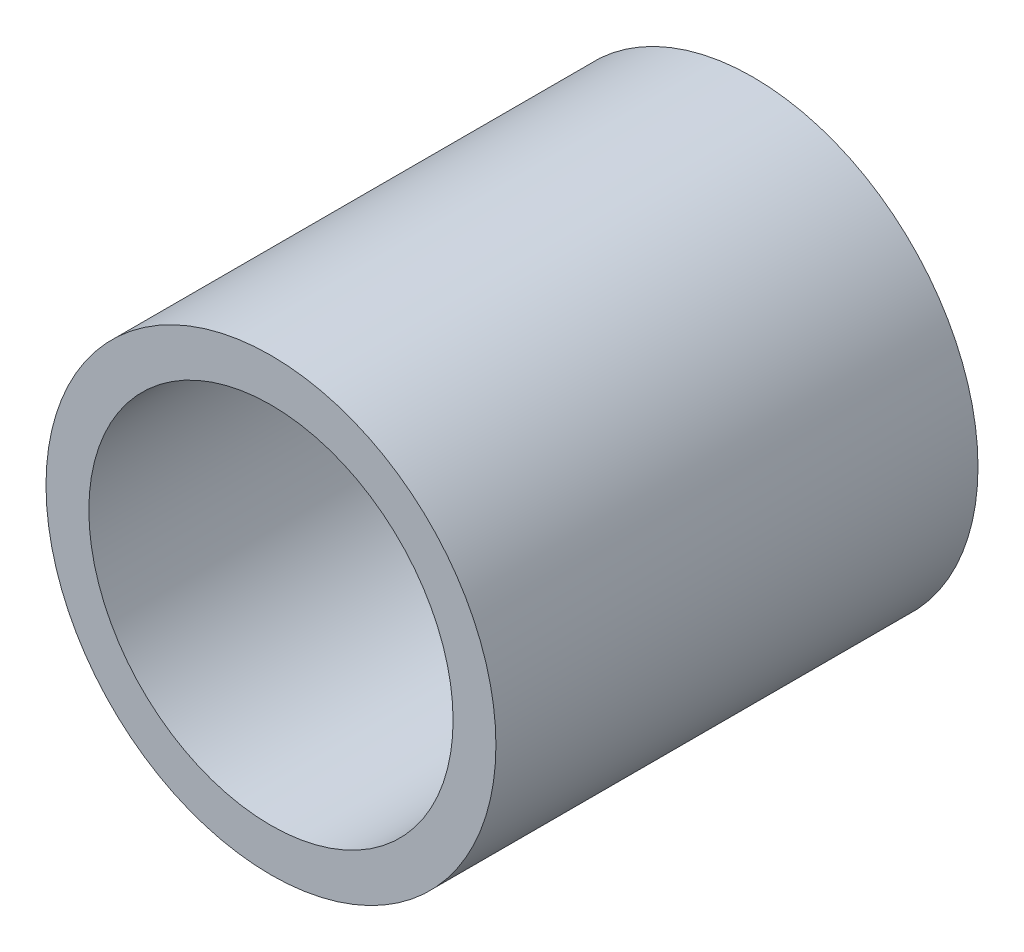
ISO-10303-21;
HEADER;
FILE_DESCRIPTION(('STEP AP214'),'2;1');
FILE_NAME('part.step','',(''),(''),'','','');
FILE_SCHEMA(('AUTOMOTIVE_DESIGN { 1 0 10303 214 1 1 1 1 }'));
ENDSEC;
DATA;
#1=APPLICATION_CONTEXT('core data for automotive mechanical design processes');
#2=APPLICATION_PROTOCOL_DEFINITION('international standard','automotive_design',2000,#1);
#3=PRODUCT_CONTEXT('',#1,'mechanical');
#4=PRODUCT('Part','Part','',(#3));
#5=PRODUCT_RELATED_PRODUCT_CATEGORY('part','',(#4));
#6=PRODUCT_DEFINITION_FORMATION('','',#4);
#7=PRODUCT_DEFINITION_CONTEXT('part definition',#1,'design');
#8=PRODUCT_DEFINITION('design','',#6,#7);
#9=PRODUCT_DEFINITION_SHAPE('','',#8);
#10=(LENGTH_UNIT() NAMED_UNIT(*) SI_UNIT(.MILLI.,.METRE.));
#11=(NAMED_UNIT(*) PLANE_ANGLE_UNIT() SI_UNIT($,.RADIAN.));
#12=(NAMED_UNIT(*) SI_UNIT($,.STERADIAN.) SOLID_ANGLE_UNIT());
#13=UNCERTAINTY_MEASURE_WITH_UNIT(LENGTH_MEASURE(1.E-05),#10,'distance_accuracy_value','');
#14=(GEOMETRIC_REPRESENTATION_CONTEXT(3) GLOBAL_UNCERTAINTY_ASSIGNED_CONTEXT((#13)) GLOBAL_UNIT_ASSIGNED_CONTEXT((#10,
#11,#12)) REPRESENTATION_CONTEXT('',''));
#15=CARTESIAN_POINT('',(0.,0.,0.));
#16=DIRECTION('',(0.,0.,1.));
#17=DIRECTION('',(1.,0.,0.));
#18=AXIS2_PLACEMENT_3D('',#15,#16,#17);
#19=CARTESIAN_POINT('',(0.,0.,45.));
#20=DIRECTION('',(0.,0.,1.));
#21=DIRECTION('',(1.,0.,0.));
#22=AXIS2_PLACEMENT_3D('',#19,#20,#21);
#23=PLANE('',#22);
#24=CARTESIAN_POINT('',(0.,0.,45.));
#25=DIRECTION('',(0.,0.,1.));
#26=DIRECTION('',(1.,0.,0.));
#27=AXIS2_PLACEMENT_3D('',#24,#25,#26);
#28=CIRCLE('',#27,21.);
#29=CARTESIAN_POINT('',(-21.,0.,45.));
#30=VERTEX_POINT('',#29);
#31=EDGE_CURVE('E10',#30,#30,#28,.T.);
#32=ORIENTED_EDGE('',*,*,#31,.T.);
#33=EDGE_LOOP('',(#32));
#34=FACE_BOUND('',#33,.T.);
#35=CARTESIAN_POINT('',(0.,0.,45.));
#36=DIRECTION('',(0.,0.,1.));
#37=DIRECTION('',(1.,0.,0.));
#38=AXIS2_PLACEMENT_3D('',#35,#36,#37);
#39=CIRCLE('',#38,17.);
#40=CARTESIAN_POINT('',(-17.,0.,45.));
#41=VERTEX_POINT('',#40);
#42=EDGE_CURVE('E41',#41,#41,#39,.T.);
#43=ORIENTED_EDGE('',*,*,#42,.F.);
#44=EDGE_LOOP('',(#43));
#45=FACE_BOUND('',#44,.T.);
#46=ADVANCED_FACE('F30',(#34,#45),#23,.T.);
#47=CARTESIAN_POINT('',(0.,0.,0.));
#48=DIRECTION('',(0.,0.,1.));
#49=DIRECTION('',(1.,0.,0.));
#50=AXIS2_PLACEMENT_3D('',#47,#48,#49);
#51=PLANE('',#50);
#52=CARTESIAN_POINT('',(0.,0.,0.));
#53=DIRECTION('',(0.,0.,1.));
#54=DIRECTION('',(1.,0.,0.));
#55=AXIS2_PLACEMENT_3D('',#52,#53,#54);
#56=CIRCLE('',#55,21.);
#57=CARTESIAN_POINT('',(-21.,0.,0.));
#58=VERTEX_POINT('',#57);
#59=EDGE_CURVE('E34',#58,#58,#56,.T.);
#60=ORIENTED_EDGE('',*,*,#59,.F.);
#61=EDGE_LOOP('',(#60));
#62=FACE_BOUND('',#61,.T.);
#63=CARTESIAN_POINT('',(0.,0.,0.));
#64=DIRECTION('',(0.,0.,1.));
#65=DIRECTION('',(1.,0.,0.));
#66=AXIS2_PLACEMENT_3D('',#63,#64,#65);
#67=CIRCLE('',#66,17.);
#68=CARTESIAN_POINT('',(-17.,0.,0.));
#69=VERTEX_POINT('',#68);
#70=EDGE_CURVE('E43',#69,#69,#67,.T.);
#71=ORIENTED_EDGE('',*,*,#70,.T.);
#72=EDGE_LOOP('',(#71));
#73=FACE_BOUND('',#72,.T.);
#74=ADVANCED_FACE('F53',(#62,#73),#51,.F.);
#75=CARTESIAN_POINT('',(0.,0.,45.));
#76=DIRECTION('',(0.,0.,-1.));
#77=DIRECTION('',(-1.,0.,0.));
#78=AXIS2_PLACEMENT_3D('',#75,#76,#77);
#79=CYLINDRICAL_SURFACE('',#78,21.);
#80=CARTESIAN_POINT('',(-21.,0.,45.));
#81=CARTESIAN_POINT('',(-21.,0.,44.53125));
#82=CARTESIAN_POINT('',(-21.,0.,44.0625));
#83=CARTESIAN_POINT('',(-21.,0.,43.125));
#84=CARTESIAN_POINT('',(-21.,0.,42.65625));
#85=CARTESIAN_POINT('',(-21.,0.,41.71875));
#86=CARTESIAN_POINT('',(-21.,0.,41.25));
#87=CARTESIAN_POINT('',(-21.,0.,40.3125));
#88=CARTESIAN_POINT('',(-21.,0.,39.84375));
#89=CARTESIAN_POINT('',(-21.,0.,38.90625));
#90=CARTESIAN_POINT('',(-21.,0.,38.4375));
#91=CARTESIAN_POINT('',(-21.,0.,37.5));
#92=CARTESIAN_POINT('',(-21.,0.,37.03125));
#93=CARTESIAN_POINT('',(-21.,0.,36.09375));
#94=CARTESIAN_POINT('',(-21.,0.,35.625));
#95=CARTESIAN_POINT('',(-21.,0.,34.6875));
#96=CARTESIAN_POINT('',(-21.,0.,34.21875));
#97=CARTESIAN_POINT('',(-21.,0.,33.28125));
#98=CARTESIAN_POINT('',(-21.,0.,32.8125));
#99=CARTESIAN_POINT('',(-21.,0.,31.875));
#100=CARTESIAN_POINT('',(-21.,0.,31.40625));
#101=CARTESIAN_POINT('',(-21.,0.,30.46875));
#102=CARTESIAN_POINT('',(-21.,0.,30.));
#103=CARTESIAN_POINT('',(-21.,0.,29.0625));
#104=CARTESIAN_POINT('',(-21.,0.,28.59375));
#105=CARTESIAN_POINT('',(-21.,0.,27.65625));
#106=CARTESIAN_POINT('',(-21.,0.,27.1875));
#107=CARTESIAN_POINT('',(-21.,0.,26.25));
#108=CARTESIAN_POINT('',(-21.,0.,25.78125));
#109=CARTESIAN_POINT('',(-21.,0.,24.84375));
#110=CARTESIAN_POINT('',(-21.,0.,24.375));
#111=CARTESIAN_POINT('',(-21.,0.,23.4375));
#112=CARTESIAN_POINT('',(-21.,0.,22.96875));
#113=CARTESIAN_POINT('',(-21.,0.,22.03125));
#114=CARTESIAN_POINT('',(-21.,0.,21.5625));
#115=CARTESIAN_POINT('',(-21.,0.,20.625));
#116=CARTESIAN_POINT('',(-21.,0.,20.15625));
#117=CARTESIAN_POINT('',(-21.,0.,19.21875));
#118=CARTESIAN_POINT('',(-21.,0.,18.75));
#119=CARTESIAN_POINT('',(-21.,0.,17.8125));
#120=CARTESIAN_POINT('',(-21.,0.,17.34375));
#121=CARTESIAN_POINT('',(-21.,0.,16.40625));
#122=CARTESIAN_POINT('',(-21.,0.,15.9375));
#123=CARTESIAN_POINT('',(-21.,0.,15.));
#124=CARTESIAN_POINT('',(-21.,0.,14.53125));
#125=CARTESIAN_POINT('',(-21.,0.,13.59375));
#126=CARTESIAN_POINT('',(-21.,0.,13.125));
#127=CARTESIAN_POINT('',(-21.,0.,12.1875));
#128=CARTESIAN_POINT('',(-21.,0.,11.71875));
#129=CARTESIAN_POINT('',(-21.,0.,10.78125));
#130=CARTESIAN_POINT('',(-21.,0.,10.3125));
#131=CARTESIAN_POINT('',(-21.,0.,9.375));
#132=CARTESIAN_POINT('',(-21.,0.,8.90625));
#133=CARTESIAN_POINT('',(-21.,0.,7.96874999999999));
#134=CARTESIAN_POINT('',(-21.,0.,7.5));
#135=CARTESIAN_POINT('',(-21.,0.,6.5625));
#136=CARTESIAN_POINT('',(-21.,0.,6.09375));
#137=CARTESIAN_POINT('',(-21.,0.,5.15625));
#138=CARTESIAN_POINT('',(-21.,0.,4.68749999999999));
#139=CARTESIAN_POINT('',(-21.,0.,3.74999999999999));
#140=CARTESIAN_POINT('',(-21.,0.,3.28124999999999));
#141=CARTESIAN_POINT('',(-21.,0.,2.34374999999999));
#142=CARTESIAN_POINT('',(-21.,0.,1.87499999999999));
#143=CARTESIAN_POINT('',(-21.,0.,0.937499999999992));
#144=CARTESIAN_POINT('',(-21.,0.,0.468749999999993));
#145=CARTESIAN_POINT('',(-21.,0.,0.));
#146=B_SPLINE_CURVE_WITH_KNOTS('',3,(#80,#81,#82,#83,#84,#85,#86,#87,#88,#89,#90,#91,#92,#93,
#94,#95,#96,#97,#98,#99,#100,#101,#102,#103,#104,#105,#106,#107,#108,#109,#110,#111,#112,#113,
#114,#115,#116,#117,#118,#119,#120,#121,#122,#123,#124,#125,#126,#127,#128,#129,#130,#131,#132,
#133,#134,#135,#136,#137,#138,#139,#140,#141,#142,#143,#144,#145),.UNSPECIFIED.,.F.,.F.,(4,2,2,
2,2,2,2,2,2,2,2,2,2,2,2,2,2,2,2,2,2,2,2,2,2,2,2,2,2,2,2,2,4),(0.,1.40625,2.8125,
4.21875000000001,5.62500000000001,7.03125,8.4375,9.84375000000001,11.25,12.65625,14.0625,
15.46875,16.875,18.28125,19.6875,21.09375,22.5,23.90625,25.3125,26.71875,28.125,29.53125,
30.9375,32.34375,33.75,35.15625,36.5625,37.96875,39.375,40.78125,42.1875,43.59375,45.),.UNSPECIFIED.);
#147=EDGE_CURVE('BSEAM32',#30,#58,#146,.T.);
#148=ORIENTED_EDGE('',*,*,#31,.F.);
#149=ORIENTED_EDGE('',*,*,#59,.T.);
#150=ORIENTED_EDGE('',*,*,#147,.T.);
#151=ORIENTED_EDGE('',*,*,#147,.F.);
#152=EDGE_LOOP('',(#148,#150,#149,#151));
#153=FACE_BOUND('',#152,.T.);
#154=ADVANCED_FACE('F32',(#153),#79,.T.);
#155=CARTESIAN_POINT('',(0.,0.,45.));
#156=DIRECTION('',(0.,0.,-1.));
#157=DIRECTION('',(-1.,0.,0.));
#158=AXIS2_PLACEMENT_3D('',#155,#156,#157);
#159=CYLINDRICAL_SURFACE('',#158,17.);
#160=CARTESIAN_POINT('',(-17.,0.,45.));
#161=CARTESIAN_POINT('',(-17.,0.,44.53125));
#162=CARTESIAN_POINT('',(-17.,0.,44.0625));
#163=CARTESIAN_POINT('',(-17.,0.,43.125));
#164=CARTESIAN_POINT('',(-17.,0.,42.65625));
#165=CARTESIAN_POINT('',(-17.,0.,41.71875));
#166=CARTESIAN_POINT('',(-17.,0.,41.25));
#167=CARTESIAN_POINT('',(-17.,0.,40.3125));
#168=CARTESIAN_POINT('',(-17.,0.,39.84375));
#169=CARTESIAN_POINT('',(-17.,0.,38.90625));
#170=CARTESIAN_POINT('',(-17.,0.,38.4375));
#171=CARTESIAN_POINT('',(-17.,0.,37.5));
#172=CARTESIAN_POINT('',(-17.,0.,37.03125));
#173=CARTESIAN_POINT('',(-17.,0.,36.09375));
#174=CARTESIAN_POINT('',(-17.,0.,35.625));
#175=CARTESIAN_POINT('',(-17.,0.,34.6875));
#176=CARTESIAN_POINT('',(-17.,0.,34.21875));
#177=CARTESIAN_POINT('',(-17.,0.,33.28125));
#178=CARTESIAN_POINT('',(-17.,0.,32.8125));
#179=CARTESIAN_POINT('',(-17.,0.,31.875));
#180=CARTESIAN_POINT('',(-17.,0.,31.40625));
#181=CARTESIAN_POINT('',(-17.,0.,30.46875));
#182=CARTESIAN_POINT('',(-17.,0.,30.));
#183=CARTESIAN_POINT('',(-17.,0.,29.0625));
#184=CARTESIAN_POINT('',(-17.,0.,28.59375));
#185=CARTESIAN_POINT('',(-17.,0.,27.65625));
#186=CARTESIAN_POINT('',(-17.,0.,27.1875));
#187=CARTESIAN_POINT('',(-17.,0.,26.25));
#188=CARTESIAN_POINT('',(-17.,0.,25.78125));
#189=CARTESIAN_POINT('',(-17.,0.,24.84375));
#190=CARTESIAN_POINT('',(-17.,0.,24.375));
#191=CARTESIAN_POINT('',(-17.,0.,23.4375));
#192=CARTESIAN_POINT('',(-17.,0.,22.96875));
#193=CARTESIAN_POINT('',(-17.,0.,22.03125));
#194=CARTESIAN_POINT('',(-17.,0.,21.5625));
#195=CARTESIAN_POINT('',(-17.,0.,20.625));
#196=CARTESIAN_POINT('',(-17.,0.,20.15625));
#197=CARTESIAN_POINT('',(-17.,0.,19.21875));
#198=CARTESIAN_POINT('',(-17.,0.,18.75));
#199=CARTESIAN_POINT('',(-17.,0.,17.8125));
#200=CARTESIAN_POINT('',(-17.,0.,17.34375));
#201=CARTESIAN_POINT('',(-17.,0.,16.40625));
#202=CARTESIAN_POINT('',(-17.,0.,15.9375));
#203=CARTESIAN_POINT('',(-17.,0.,15.));
#204=CARTESIAN_POINT('',(-17.,0.,14.53125));
#205=CARTESIAN_POINT('',(-17.,0.,13.59375));
#206=CARTESIAN_POINT('',(-17.,0.,13.125));
#207=CARTESIAN_POINT('',(-17.,0.,12.1875));
#208=CARTESIAN_POINT('',(-17.,0.,11.71875));
#209=CARTESIAN_POINT('',(-17.,0.,10.78125));
#210=CARTESIAN_POINT('',(-17.,0.,10.3125));
#211=CARTESIAN_POINT('',(-17.,0.,9.37499999999999));
#212=CARTESIAN_POINT('',(-17.,0.,8.90624999999999));
#213=CARTESIAN_POINT('',(-17.,0.,7.96874999999999));
#214=CARTESIAN_POINT('',(-17.,0.,7.5));
#215=CARTESIAN_POINT('',(-17.,0.,6.56249999999999));
#216=CARTESIAN_POINT('',(-17.,0.,6.09374999999999));
#217=CARTESIAN_POINT('',(-17.,0.,5.15624999999999));
#218=CARTESIAN_POINT('',(-17.,0.,4.68749999999999));
#219=CARTESIAN_POINT('',(-17.,0.,3.74999999999999));
#220=CARTESIAN_POINT('',(-17.,0.,3.28124999999999));
#221=CARTESIAN_POINT('',(-17.,0.,2.34374999999999));
#222=CARTESIAN_POINT('',(-17.,0.,1.87499999999999));
#223=CARTESIAN_POINT('',(-17.,0.,0.937499999999992));
#224=CARTESIAN_POINT('',(-17.,0.,0.468749999999993));
#225=CARTESIAN_POINT('',(-17.,0.,0.));
#226=B_SPLINE_CURVE_WITH_KNOTS('',3,(#160,#161,#162,#163,#164,#165,#166,#167,#168,#169,#170,
#171,#172,#173,#174,#175,#176,#177,#178,#179,#180,#181,#182,#183,#184,#185,#186,#187,#188,#189,
#190,#191,#192,#193,#194,#195,#196,#197,#198,#199,#200,#201,#202,#203,#204,#205,#206,#207,#208,
#209,#210,#211,#212,#213,#214,#215,#216,#217,#218,#219,#220,#221,#222,#223,#224,#225),
.UNSPECIFIED.,.F.,.F.,(4,2,2,2,2,2,2,2,2,2,2,2,2,2,2,2,2,2,2,2,2,2,2,2,2,2,2,2,2,2,2,2,4),(0.,
1.40625,2.8125,4.21874999999999,5.625,7.03125,8.43749999999999,9.84375,11.25,12.65625,14.0625,
15.46875,16.875,18.28125,19.6875,21.09375,22.5,23.90625,25.3125,26.71875,28.125,29.53125,
30.9375,32.34375,33.75,35.15625,36.5625,37.96875,39.375,40.78125,42.1875,43.59375,45.),.UNSPECIFIED.);
#227=EDGE_CURVE('BSEAM49',#41,#69,#226,.T.);
#228=ORIENTED_EDGE('',*,*,#42,.T.);
#229=ORIENTED_EDGE('',*,*,#70,.F.);
#230=ORIENTED_EDGE('',*,*,#227,.T.);
#231=ORIENTED_EDGE('',*,*,#227,.F.);
#232=EDGE_LOOP('',(#228,#230,#229,#231));
#233=FACE_BOUND('',#232,.T.);
#234=ADVANCED_FACE('F49',(#233),#159,.F.);
#235=CLOSED_SHELL('',(#46,#74,#154,#234));
#236=MANIFOLD_SOLID_BREP('B2',#235);
#237=ADVANCED_BREP_SHAPE_REPRESENTATION('',(#18,#236),#14);
#238=SHAPE_DEFINITION_REPRESENTATION(#9,#237);
ENDSEC;
END-ISO-10303-21;
